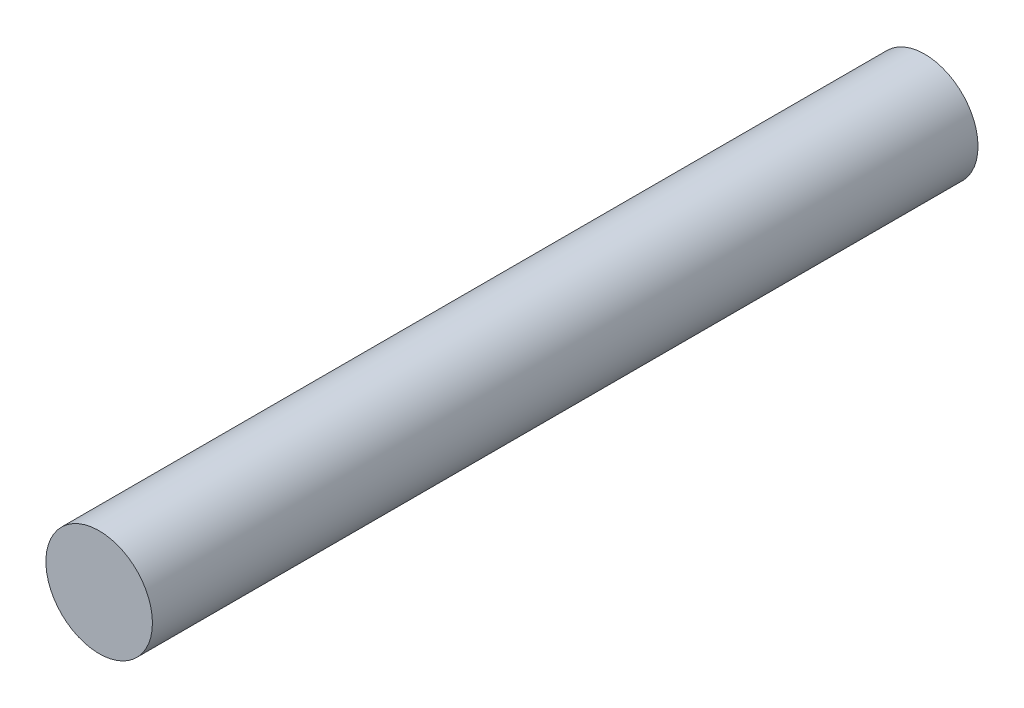
ISO-10303-21;
HEADER;
FILE_DESCRIPTION(('STEP AP214'),'2;1');
FILE_NAME('part.step','',(''),(''),'','','');
FILE_SCHEMA(('AUTOMOTIVE_DESIGN { 1 0 10303 214 1 1 1 1 }'));
ENDSEC;
DATA;
#1=APPLICATION_CONTEXT('core data for automotive mechanical design processes');
#2=APPLICATION_PROTOCOL_DEFINITION('international standard','automotive_design',2000,#1);
#3=PRODUCT_CONTEXT('',#1,'mechanical');
#4=PRODUCT('Part','Part','',(#3));
#5=PRODUCT_RELATED_PRODUCT_CATEGORY('part','',(#4));
#6=PRODUCT_DEFINITION_FORMATION('','',#4);
#7=PRODUCT_DEFINITION_CONTEXT('part definition',#1,'design');
#8=PRODUCT_DEFINITION('design','',#6,#7);
#9=PRODUCT_DEFINITION_SHAPE('','',#8);
#10=(LENGTH_UNIT() NAMED_UNIT(*) SI_UNIT(.MILLI.,.METRE.));
#11=(NAMED_UNIT(*) PLANE_ANGLE_UNIT() SI_UNIT($,.RADIAN.));
#12=(NAMED_UNIT(*) SI_UNIT($,.STERADIAN.) SOLID_ANGLE_UNIT());
#13=UNCERTAINTY_MEASURE_WITH_UNIT(LENGTH_MEASURE(1.E-05),#10,'distance_accuracy_value','');
#14=(GEOMETRIC_REPRESENTATION_CONTEXT(3) GLOBAL_UNCERTAINTY_ASSIGNED_CONTEXT((#13)) GLOBAL_UNIT_ASSIGNED_CONTEXT((#10,
#11,#12)) REPRESENTATION_CONTEXT('',''));
#15=CARTESIAN_POINT('',(0.,0.,0.));
#16=DIRECTION('',(0.,0.,1.));
#17=DIRECTION('',(1.,0.,0.));
#18=AXIS2_PLACEMENT_3D('',#15,#16,#17);
#19=CARTESIAN_POINT('',(0.,0.,49.2125));
#20=DIRECTION('',(0.,0.,-1.));
#21=DIRECTION('',(-1.,0.,0.));
#22=AXIS2_PLACEMENT_3D('',#19,#20,#21);
#23=CYLINDRICAL_SURFACE('',#22,3.175);
#24=CARTESIAN_POINT('',(0.,0.,49.2125));
#25=DIRECTION('',(0.,0.,1.));
#26=DIRECTION('',(1.,0.,0.));
#27=AXIS2_PLACEMENT_3D('',#24,#25,#26);
#28=CIRCLE('',#27,3.175);
#29=CARTESIAN_POINT('',(3.175,0.,49.2125));
#30=VERTEX_POINT('',#29);
#31=EDGE_CURVE('E10',#30,#30,#28,.T.);
#32=ORIENTED_EDGE('',*,*,#31,.F.);
#33=EDGE_LOOP('',(#32));
#34=FACE_BOUND('',#33,.T.);
#35=CARTESIAN_POINT('',(0.,0.,0.));
#36=DIRECTION('',(0.,0.,1.));
#37=DIRECTION('',(1.,0.,0.));
#38=AXIS2_PLACEMENT_3D('',#35,#36,#37);
#39=CIRCLE('',#38,3.175);
#40=CARTESIAN_POINT('',(3.175,0.,0.));
#41=VERTEX_POINT('',#40);
#42=EDGE_CURVE('E34',#41,#41,#39,.T.);
#43=ORIENTED_EDGE('',*,*,#42,.T.);
#44=EDGE_LOOP('',(#43));
#45=FACE_BOUND('',#44,.T.);
#46=ADVANCED_FACE('F31',(#34,#45),#23,.T.);
#47=CARTESIAN_POINT('',(0.,0.,49.2125));
#48=DIRECTION('',(0.,0.,1.));
#49=DIRECTION('',(1.,0.,0.));
#50=AXIS2_PLACEMENT_3D('',#47,#48,#49);
#51=PLANE('',#50);
#52=ORIENTED_EDGE('',*,*,#31,.T.);
#53=EDGE_LOOP('',(#52));
#54=FACE_BOUND('',#53,.T.);
#55=ADVANCED_FACE('F46',(#54),#51,.T.);
#56=CARTESIAN_POINT('',(0.,0.,0.));
#57=DIRECTION('',(0.,0.,1.));
#58=DIRECTION('',(1.,0.,0.));
#59=AXIS2_PLACEMENT_3D('',#56,#57,#58);
#60=PLANE('',#59);
#61=ORIENTED_EDGE('',*,*,#42,.F.);
#62=EDGE_LOOP('',(#61));
#63=FACE_BOUND('',#62,.T.);
#64=ADVANCED_FACE('F44',(#63),#60,.F.);
#65=CLOSED_SHELL('',(#46,#55,#64));
#66=MANIFOLD_SOLID_BREP('B2',#65);
#67=ADVANCED_BREP_SHAPE_REPRESENTATION('',(#18,#66),#14);
#68=SHAPE_DEFINITION_REPRESENTATION(#9,#67);
ENDSEC;
END-ISO-10303-21;
